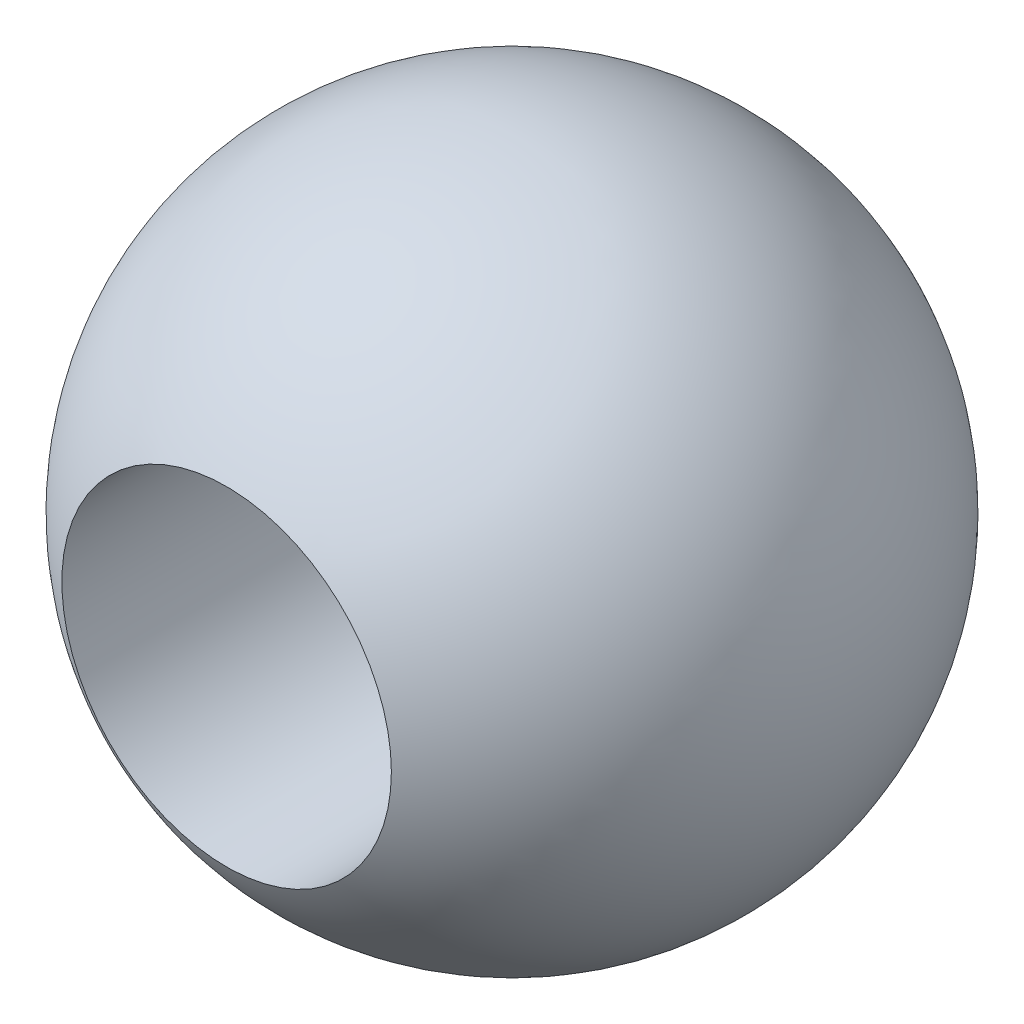
ISO-10303-21;
HEADER;
FILE_DESCRIPTION(('STEP AP214'),'2;1');
FILE_NAME('part.step','',(''),(''),'','','');
FILE_SCHEMA(('AUTOMOTIVE_DESIGN { 1 0 10303 214 1 1 1 1 }'));
ENDSEC;
DATA;
#1=APPLICATION_CONTEXT('core data for automotive mechanical design processes');
#2=APPLICATION_PROTOCOL_DEFINITION('international standard','automotive_design',2000,#1);
#3=PRODUCT_CONTEXT('',#1,'mechanical');
#4=PRODUCT('Part','Part','',(#3));
#5=PRODUCT_RELATED_PRODUCT_CATEGORY('part','',(#4));
#6=PRODUCT_DEFINITION_FORMATION('','',#4);
#7=PRODUCT_DEFINITION_CONTEXT('part definition',#1,'design');
#8=PRODUCT_DEFINITION('design','',#6,#7);
#9=PRODUCT_DEFINITION_SHAPE('','',#8);
#10=(LENGTH_UNIT() NAMED_UNIT(*) SI_UNIT(.MILLI.,.METRE.));
#11=(NAMED_UNIT(*) PLANE_ANGLE_UNIT() SI_UNIT($,.RADIAN.));
#12=(NAMED_UNIT(*) SI_UNIT($,.STERADIAN.) SOLID_ANGLE_UNIT());
#13=UNCERTAINTY_MEASURE_WITH_UNIT(LENGTH_MEASURE(1.E-05),#10,'distance_accuracy_value','');
#14=(GEOMETRIC_REPRESENTATION_CONTEXT(3) GLOBAL_UNCERTAINTY_ASSIGNED_CONTEXT((#13)) GLOBAL_UNIT_ASSIGNED_CONTEXT((#10,
#11,#12)) REPRESENTATION_CONTEXT('',''));
#15=CARTESIAN_POINT('',(0.,0.,0.));
#16=DIRECTION('',(0.,0.,1.));
#17=DIRECTION('',(1.,0.,0.));
#18=AXIS2_PLACEMENT_3D('',#15,#16,#17);
#19=CARTESIAN_POINT('',(0.,0.,0.));
#20=DIRECTION('',(0.,-1.,0.));
#21=DIRECTION('',(1.,0.,0.));
#22=AXIS2_PLACEMENT_3D('',#19,#20,#21);
#23=SPHERICAL_SURFACE('',#22,3.302);
#24=CARTESIAN_POINT('',(0.,0.,0.));
#25=DIRECTION('',(0.,0.,-1.));
#26=DIRECTION('',(-1.,0.,0.));
#27=AXIS2_PLACEMENT_3D('',#24,#25,#26);
#28=SPHERICAL_SURFACE('',#27,3.302);
#29=CARTESIAN_POINT('',(0.,0.,2.85961588329622));
#30=DIRECTION('',(0.,0.,-1.));
#31=DIRECTION('',(-1.,0.,0.));
#32=AXIS2_PLACEMENT_3D('',#29,#30,#31);
#33=CIRCLE('',#32,1.651);
#34=CARTESIAN_POINT('',(1.651,0.,2.85961588329622));
#35=VERTEX_POINT('',#34);
#36=EDGE_CURVE('E10',#35,#35,#33,.T.);
#37=ORIENTED_EDGE('',*,*,#36,.T.);
#38=EDGE_LOOP('',(#37));
#39=FACE_BOUND('',#38,.T.);
#40=CARTESIAN_POINT('',(0.,0.,-2.85961588329622));
#41=DIRECTION('',(0.,0.,1.));
#42=DIRECTION('',(1.,0.,0.));
#43=AXIS2_PLACEMENT_3D('',#40,#41,#42);
#44=CIRCLE('',#43,1.651);
#45=CARTESIAN_POINT('',(1.651,0.,-2.85961588329622));
#46=VERTEX_POINT('',#45);
#47=EDGE_CURVE('E49',#46,#46,#44,.T.);
#48=ORIENTED_EDGE('',*,*,#47,.T.);
#49=EDGE_LOOP('',(#48));
#50=FACE_BOUND('',#49,.T.);
#51=ADVANCED_FACE('F43',(#39,#50),#28,.T.);
#52=CARTESIAN_POINT('',(0.,0.,-3.302));
#53=DIRECTION('',(0.,0.,1.));
#54=DIRECTION('',(1.,0.,0.));
#55=AXIS2_PLACEMENT_3D('',#52,#53,#54);
#56=CYLINDRICAL_SURFACE('',#55,1.651);
#57=CARTESIAN_POINT('',(1.651,0.,-2.85961588329622));
#58=CARTESIAN_POINT('',(1.651,0.,-2.80004055239421));
#59=CARTESIAN_POINT('',(1.651,0.,-2.74046522149221));
#60=CARTESIAN_POINT('',(1.651,0.,-2.6213145596882));
#61=CARTESIAN_POINT('',(1.651,0.,-2.56173922878619));
#62=CARTESIAN_POINT('',(1.651,0.,-2.44258856698219));
#63=CARTESIAN_POINT('',(1.651,0.,-2.38301323608018));
#64=CARTESIAN_POINT('',(1.651,0.,-2.26386257427617));
#65=CARTESIAN_POINT('',(1.651,0.,-2.20428724337417));
#66=CARTESIAN_POINT('',(1.651,0.,-2.08513658157016));
#67=CARTESIAN_POINT('',(1.651,0.,-2.02556125066815));
#68=CARTESIAN_POINT('',(1.651,0.,-1.90641058886414));
#69=CARTESIAN_POINT('',(1.651,0.,-1.84683525796214));
#70=CARTESIAN_POINT('',(1.651,0.,-1.72768459615813));
#71=CARTESIAN_POINT('',(1.651,0.,-1.66810926525613));
#72=CARTESIAN_POINT('',(1.651,0.,-1.54895860345212));
#73=CARTESIAN_POINT('',(1.651,0.,-1.48938327255011));
#74=CARTESIAN_POINT('',(1.651,0.,-1.3702326107461));
#75=CARTESIAN_POINT('',(1.651,0.,-1.3106572798441));
#76=CARTESIAN_POINT('',(1.651,0.,-1.19150661804009));
#77=CARTESIAN_POINT('',(1.651,0.,-1.13193128713809));
#78=CARTESIAN_POINT('',(1.651,0.,-1.01278062533408));
#79=CARTESIAN_POINT('',(1.651,0.,-0.953205294432073));
#80=CARTESIAN_POINT('',(1.651,0.,-0.834054632628064));
#81=CARTESIAN_POINT('',(1.651,0.,-0.774479301726059));
#82=CARTESIAN_POINT('',(1.651,0.,-0.65532863992205));
#83=CARTESIAN_POINT('',(1.651,0.,-0.595753309020046));
#84=CARTESIAN_POINT('',(1.651,0.,-0.476602647216037));
#85=CARTESIAN_POINT('',(1.651,0.,-0.417027316314032));
#86=CARTESIAN_POINT('',(1.651,0.,-0.297876654510023));
#87=CARTESIAN_POINT('',(1.651,0.,-0.238301323608019));
#88=CARTESIAN_POINT('',(1.651,0.,-0.11915066180401));
#89=CARTESIAN_POINT('',(1.651,0.,-0.0595753309020052));
#90=CARTESIAN_POINT('',(1.651,0.,0.0595753309020038));
#91=CARTESIAN_POINT('',(1.651,0.,0.119150661804008));
#92=CARTESIAN_POINT('',(1.651,0.,0.238301323608017));
#93=CARTESIAN_POINT('',(1.651,0.,0.297876654510022));
#94=CARTESIAN_POINT('',(1.651,0.,0.417027316314031));
#95=CARTESIAN_POINT('',(1.651,0.,0.476602647216036));
#96=CARTESIAN_POINT('',(1.651,0.,0.595753309020044));
#97=CARTESIAN_POINT('',(1.651,0.,0.655328639922049));
#98=CARTESIAN_POINT('',(1.651,0.,0.774479301726058));
#99=CARTESIAN_POINT('',(1.651,0.,0.834054632628062));
#100=CARTESIAN_POINT('',(1.651,0.,0.953205294432071));
#101=CARTESIAN_POINT('',(1.651,0.,1.01278062533408));
#102=CARTESIAN_POINT('',(1.651,0.,1.13193128713808));
#103=CARTESIAN_POINT('',(1.651,0.,1.19150661804009));
#104=CARTESIAN_POINT('',(1.651,0.,1.3106572798441));
#105=CARTESIAN_POINT('',(1.651,0.,1.3702326107461));
#106=CARTESIAN_POINT('',(1.651,0.,1.48938327255011));
#107=CARTESIAN_POINT('',(1.651,0.,1.54895860345212));
#108=CARTESIAN_POINT('',(1.651,0.,1.66810926525613));
#109=CARTESIAN_POINT('',(1.651,0.,1.72768459615813));
#110=CARTESIAN_POINT('',(1.651,0.,1.84683525796214));
#111=CARTESIAN_POINT('',(1.651,0.,1.90641058886414));
#112=CARTESIAN_POINT('',(1.651,0.,2.02556125066815));
#113=CARTESIAN_POINT('',(1.651,0.,2.08513658157016));
#114=CARTESIAN_POINT('',(1.651,0.,2.20428724337417));
#115=CARTESIAN_POINT('',(1.651,0.,2.26386257427617));
#116=CARTESIAN_POINT('',(1.651,0.,2.38301323608018));
#117=CARTESIAN_POINT('',(1.651,0.,2.44258856698218));
#118=CARTESIAN_POINT('',(1.651,0.,2.56173922878619));
#119=CARTESIAN_POINT('',(1.651,0.,2.6213145596882));
#120=CARTESIAN_POINT('',(1.651,0.,2.74046522149221));
#121=CARTESIAN_POINT('',(1.651,0.,2.80004055239421));
#122=CARTESIAN_POINT('',(1.651,0.,2.85961588329622));
#123=B_SPLINE_CURVE_WITH_KNOTS('',3,(#57,#58,#59,#60,#61,#62,#63,#64,#65,#66,#67,#68,#69,#70,
#71,#72,#73,#74,#75,#76,#77,#78,#79,#80,#81,#82,#83,#84,#85,#86,#87,#88,#89,#90,#91,#92,#93,#94,
#95,#96,#97,#98,#99,#100,#101,#102,#103,#104,#105,#106,#107,#108,#109,#110,#111,#112,#113,#114,
#115,#116,#117,#118,#119,#120,#121,#122),.UNSPECIFIED.,.F.,.F.,(4,2,2,2,2,2,2,2,2,2,2,2,2,2,2,2,
2,2,2,2,2,2,2,2,2,2,2,2,2,2,2,2,4),(0.,0.178725992706014,0.357451985412027,0.536177978118041,
0.714903970824054,0.893629963530068,1.07235595623608,1.25108194894209,1.42980794164811,
1.60853393435412,1.78725992706014,1.96598591976615,2.14471191247216,2.32343790517818,
2.50216389788419,2.6808898905902,2.85961588329622,3.03834187600223,3.21706786870824,
3.39579386141426,3.57451985412027,3.75324584682628,3.9319718395323,4.11069783223831,
4.28942382494432,4.46814981765034,4.64687581035635,4.82560180306236,5.00432779576838,
5.18305378847439,5.36177978118041,5.54050577388642,5.71923176659243),.UNSPECIFIED.);
#124=EDGE_CURVE('BSEAM56',#46,#35,#123,.T.);
#125=ORIENTED_EDGE('',*,*,#47,.F.);
#126=ORIENTED_EDGE('',*,*,#36,.F.);
#127=ORIENTED_EDGE('',*,*,#124,.T.);
#128=ORIENTED_EDGE('',*,*,#124,.F.);
#129=EDGE_LOOP('',(#125,#127,#126,#128));
#130=FACE_BOUND('',#129,.T.);
#131=ADVANCED_FACE('F56',(#130),#56,.F.);
#132=CLOSED_SHELL('',(#51,#131));
#133=MANIFOLD_SOLID_BREP('B2',#132);
#134=ADVANCED_BREP_SHAPE_REPRESENTATION('',(#18,#133),#14);
#135=SHAPE_DEFINITION_REPRESENTATION(#9,#134);
ENDSEC;
END-ISO-10303-21;
